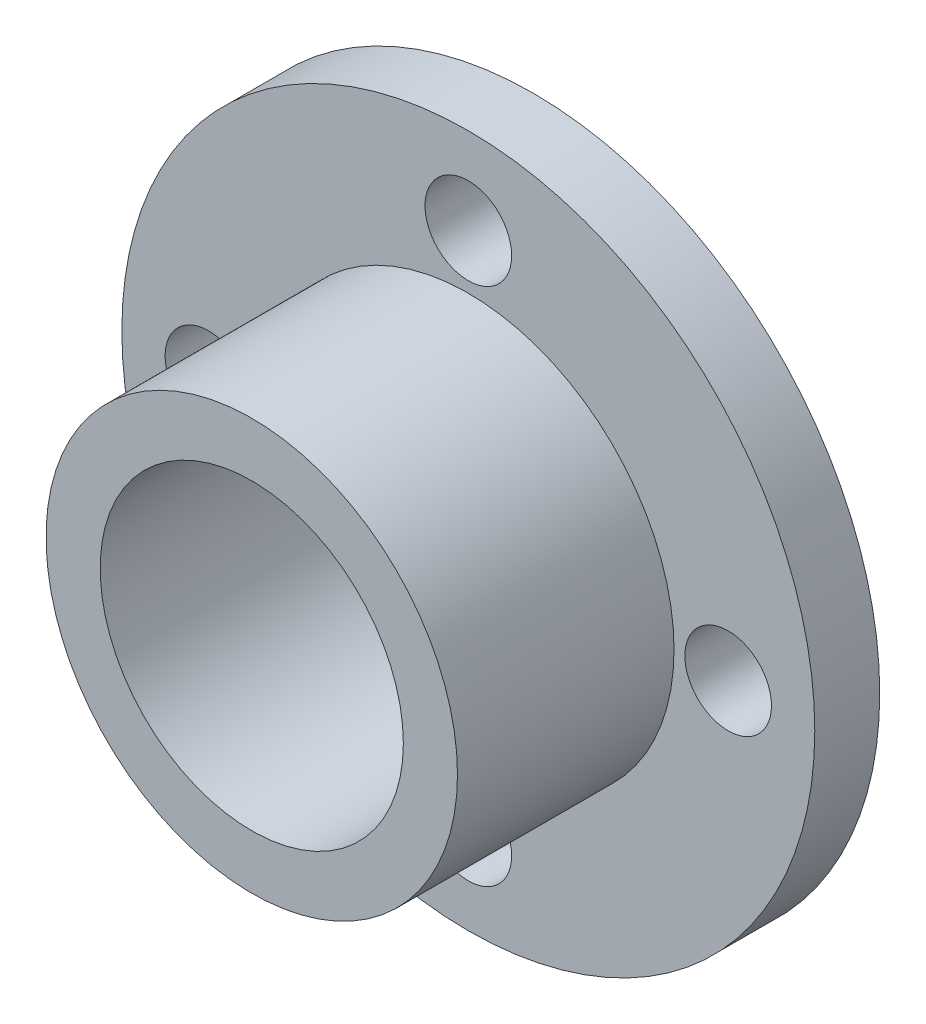
ISO-10303-21;
HEADER;
FILE_DESCRIPTION(('STEP AP214'),'2;1');
FILE_NAME('part.step','',(''),(''),'','','');
FILE_SCHEMA(('AUTOMOTIVE_DESIGN { 1 0 10303 214 1 1 1 1 }'));
ENDSEC;
DATA;
#1=APPLICATION_CONTEXT('core data for automotive mechanical design processes');
#2=APPLICATION_PROTOCOL_DEFINITION('international standard','automotive_design',2000,#1);
#3=PRODUCT_CONTEXT('',#1,'mechanical');
#4=PRODUCT('Part','Part','',(#3));
#5=PRODUCT_RELATED_PRODUCT_CATEGORY('part','',(#4));
#6=PRODUCT_DEFINITION_FORMATION('','',#4);
#7=PRODUCT_DEFINITION_CONTEXT('part definition',#1,'design');
#8=PRODUCT_DEFINITION('design','',#6,#7);
#9=PRODUCT_DEFINITION_SHAPE('','',#8);
#10=(LENGTH_UNIT() NAMED_UNIT(*) SI_UNIT(.MILLI.,.METRE.));
#11=(NAMED_UNIT(*) PLANE_ANGLE_UNIT() SI_UNIT($,.RADIAN.));
#12=(NAMED_UNIT(*) SI_UNIT($,.STERADIAN.) SOLID_ANGLE_UNIT());
#13=UNCERTAINTY_MEASURE_WITH_UNIT(LENGTH_MEASURE(1.E-05),#10,'distance_accuracy_value','');
#14=(GEOMETRIC_REPRESENTATION_CONTEXT(3) GLOBAL_UNCERTAINTY_ASSIGNED_CONTEXT((#13)) GLOBAL_UNIT_ASSIGNED_CONTEXT((#10,
#11,#12)) REPRESENTATION_CONTEXT('',''));
#15=CARTESIAN_POINT('',(0.,0.,0.));
#16=DIRECTION('',(0.,0.,1.));
#17=DIRECTION('',(1.,0.,0.));
#18=AXIS2_PLACEMENT_3D('',#15,#16,#17);
#19=CARTESIAN_POINT('',(0.,0.,3.));
#20=DIRECTION('',(0.,0.,1.));
#21=DIRECTION('',(1.,0.,0.));
#22=AXIS2_PLACEMENT_3D('',#19,#20,#21);
#23=PLANE('',#22);
#24=CARTESIAN_POINT('',(0.,-12.,3.));
#25=DIRECTION('',(0.,0.,1.));
#26=DIRECTION('',(1.,0.,0.));
#27=AXIS2_PLACEMENT_3D('',#24,#25,#26);
#28=CIRCLE('',#27,2.);
#29=CARTESIAN_POINT('',(2.,-12.,3.));
#30=VERTEX_POINT('',#29);
#31=EDGE_CURVE('E62',#30,#30,#28,.T.);
#32=ORIENTED_EDGE('',*,*,#31,.F.);
#33=EDGE_LOOP('',(#32));
#34=FACE_BOUND('',#33,.T.);
#35=CARTESIAN_POINT('',(-12.,0.,3.));
#36=DIRECTION('',(0.,0.,1.));
#37=DIRECTION('',(1.,0.,0.));
#38=AXIS2_PLACEMENT_3D('',#35,#36,#37);
#39=CIRCLE('',#38,2.);
#40=CARTESIAN_POINT('',(-10.,0.,3.));
#41=VERTEX_POINT('',#40);
#42=EDGE_CURVE('E122',#41,#41,#39,.T.);
#43=ORIENTED_EDGE('',*,*,#42,.F.);
#44=EDGE_LOOP('',(#43));
#45=FACE_BOUND('',#44,.T.);
#46=CARTESIAN_POINT('',(0.,12.,3.));
#47=DIRECTION('',(0.,0.,1.));
#48=DIRECTION('',(1.,0.,0.));
#49=AXIS2_PLACEMENT_3D('',#46,#47,#48);
#50=CIRCLE('',#49,2.);
#51=CARTESIAN_POINT('',(2.00000000000008,12.,3.));
#52=VERTEX_POINT('',#51);
#53=EDGE_CURVE('E126',#52,#52,#50,.T.);
#54=ORIENTED_EDGE('',*,*,#53,.F.);
#55=EDGE_LOOP('',(#54));
#56=FACE_BOUND('',#55,.T.);
#57=CARTESIAN_POINT('',(12.,-1.25693328198353E-13,3.));
#58=DIRECTION('',(0.,0.,1.));
#59=DIRECTION('',(1.,0.,0.));
#60=AXIS2_PLACEMENT_3D('',#57,#58,#59);
#61=CIRCLE('',#60,2.);
#62=CARTESIAN_POINT('',(14.,-1.25693328198353E-13,3.));
#63=VERTEX_POINT('',#62);
#64=EDGE_CURVE('E86',#63,#63,#61,.T.);
#65=ORIENTED_EDGE('',*,*,#64,.F.);
#66=EDGE_LOOP('',(#65));
#67=FACE_BOUND('',#66,.T.);
#68=CARTESIAN_POINT('',(0.,0.,3.));
#69=DIRECTION('',(0.,0.,1.));
#70=DIRECTION('',(1.,0.,0.));
#71=AXIS2_PLACEMENT_3D('',#68,#69,#70);
#72=CIRCLE('',#71,16.);
#73=CARTESIAN_POINT('',(16.,0.,3.));
#74=VERTEX_POINT('',#73);
#75=EDGE_CURVE('E10',#74,#74,#72,.T.);
#76=ORIENTED_EDGE('',*,*,#75,.T.);
#77=EDGE_LOOP('',(#76));
#78=FACE_BOUND('',#77,.T.);
#79=CARTESIAN_POINT('',(0.,0.,3.));
#80=DIRECTION('',(0.,0.,1.));
#81=DIRECTION('',(1.,0.,0.));
#82=AXIS2_PLACEMENT_3D('',#79,#80,#81);
#83=CIRCLE('',#82,9.5);
#84=CARTESIAN_POINT('',(9.5,0.,3.));
#85=VERTEX_POINT('',#84);
#86=EDGE_CURVE('E77',#85,#85,#83,.T.);
#87=ORIENTED_EDGE('',*,*,#86,.F.);
#88=EDGE_LOOP('',(#87));
#89=FACE_BOUND('',#88,.T.);
#90=ADVANCED_FACE('F37',(#34,#45,#56,#67,#78,#89),#23,.T.);
#91=CARTESIAN_POINT('',(0.,0.,0.));
#92=DIRECTION('',(0.,0.,1.));
#93=DIRECTION('',(1.,0.,0.));
#94=AXIS2_PLACEMENT_3D('',#91,#92,#93);
#95=PLANE('',#94);
#96=CARTESIAN_POINT('',(0.,-12.,0.));
#97=DIRECTION('',(0.,0.,1.));
#98=DIRECTION('',(1.,0.,0.));
#99=AXIS2_PLACEMENT_3D('',#96,#97,#98);
#100=CIRCLE('',#99,2.);
#101=CARTESIAN_POINT('',(2.,-12.,0.));
#102=VERTEX_POINT('',#101);
#103=EDGE_CURVE('E41',#102,#102,#100,.T.);
#104=ORIENTED_EDGE('',*,*,#103,.T.);
#105=EDGE_LOOP('',(#104));
#106=FACE_BOUND('',#105,.T.);
#107=CARTESIAN_POINT('',(-12.,0.,0.));
#108=DIRECTION('',(0.,0.,1.));
#109=DIRECTION('',(1.,0.,0.));
#110=AXIS2_PLACEMENT_3D('',#107,#108,#109);
#111=CIRCLE('',#110,2.);
#112=CARTESIAN_POINT('',(-10.,0.,0.));
#113=VERTEX_POINT('',#112);
#114=EDGE_CURVE('E65',#113,#113,#111,.T.);
#115=ORIENTED_EDGE('',*,*,#114,.T.);
#116=EDGE_LOOP('',(#115));
#117=FACE_BOUND('',#116,.T.);
#118=CARTESIAN_POINT('',(0.,12.,0.));
#119=DIRECTION('',(0.,0.,1.));
#120=DIRECTION('',(1.,0.,0.));
#121=AXIS2_PLACEMENT_3D('',#118,#119,#120);
#122=CIRCLE('',#121,2.);
#123=CARTESIAN_POINT('',(2.00000000000008,12.,0.));
#124=VERTEX_POINT('',#123);
#125=EDGE_CURVE('E61',#124,#124,#122,.T.);
#126=ORIENTED_EDGE('',*,*,#125,.T.);
#127=EDGE_LOOP('',(#126));
#128=FACE_BOUND('',#127,.T.);
#129=CARTESIAN_POINT('',(12.,-1.25693328198353E-13,0.));
#130=DIRECTION('',(0.,0.,1.));
#131=DIRECTION('',(1.,0.,0.));
#132=AXIS2_PLACEMENT_3D('',#129,#130,#131);
#133=CIRCLE('',#132,2.);
#134=CARTESIAN_POINT('',(14.,-1.25693328198353E-13,0.));
#135=VERTEX_POINT('',#134);
#136=EDGE_CURVE('E57',#135,#135,#133,.T.);
#137=ORIENTED_EDGE('',*,*,#136,.T.);
#138=EDGE_LOOP('',(#137));
#139=FACE_BOUND('',#138,.T.);
#140=CARTESIAN_POINT('',(0.,0.,0.));
#141=DIRECTION('',(0.,0.,1.));
#142=DIRECTION('',(1.,0.,0.));
#143=AXIS2_PLACEMENT_3D('',#140,#141,#142);
#144=CIRCLE('',#143,16.);
#145=CARTESIAN_POINT('',(16.,0.,0.));
#146=VERTEX_POINT('',#145);
#147=EDGE_CURVE('E46',#146,#146,#144,.T.);
#148=ORIENTED_EDGE('',*,*,#147,.F.);
#149=EDGE_LOOP('',(#148));
#150=FACE_BOUND('',#149,.T.);
#151=CARTESIAN_POINT('',(0.,0.,0.));
#152=DIRECTION('',(0.,0.,1.));
#153=DIRECTION('',(1.,0.,0.));
#154=AXIS2_PLACEMENT_3D('',#151,#152,#153);
#155=CIRCLE('',#154,7.);
#156=CARTESIAN_POINT('',(7.,0.,0.));
#157=VERTEX_POINT('',#156);
#158=EDGE_CURVE('E52',#157,#157,#155,.T.);
#159=ORIENTED_EDGE('',*,*,#158,.T.);
#160=EDGE_LOOP('',(#159));
#161=FACE_BOUND('',#160,.T.);
#162=ADVANCED_FACE('F96',(#106,#117,#128,#139,#150,#161),#95,.F.);
#163=CARTESIAN_POINT('',(0.,0.,3.));
#164=DIRECTION('',(0.,0.,-1.));
#165=DIRECTION('',(-1.,0.,0.));
#166=AXIS2_PLACEMENT_3D('',#163,#164,#165);
#167=CYLINDRICAL_SURFACE('',#166,16.);
#168=ORIENTED_EDGE('',*,*,#75,.F.);
#169=EDGE_LOOP('',(#168));
#170=FACE_BOUND('',#169,.T.);
#171=ORIENTED_EDGE('',*,*,#147,.T.);
#172=EDGE_LOOP('',(#171));
#173=FACE_BOUND('',#172,.T.);
#174=ADVANCED_FACE('F39',(#170,#173),#167,.T.);
#175=CARTESIAN_POINT('',(0.,0.,3.));
#176=DIRECTION('',(0.,0.,-1.));
#177=DIRECTION('',(-1.,0.,0.));
#178=AXIS2_PLACEMENT_3D('',#175,#176,#177);
#179=CYLINDRICAL_SURFACE('',#178,7.);
#180=ORIENTED_EDGE('',*,*,#158,.F.);
#181=EDGE_LOOP('',(#180));
#182=FACE_BOUND('',#181,.T.);
#183=CARTESIAN_POINT('',(0.,0.,13.));
#184=DIRECTION('',(0.,0.,1.));
#185=DIRECTION('',(1.,0.,0.));
#186=AXIS2_PLACEMENT_3D('',#183,#184,#185);
#187=CIRCLE('',#186,7.);
#188=CARTESIAN_POINT('',(7.,0.,13.));
#189=VERTEX_POINT('',#188);
#190=EDGE_CURVE('E72',#189,#189,#187,.T.);
#191=ORIENTED_EDGE('',*,*,#190,.T.);
#192=EDGE_LOOP('',(#191));
#193=FACE_BOUND('',#192,.T.);
#194=ADVANCED_FACE('F98',(#182,#193),#179,.F.);
#195=CARTESIAN_POINT('',(0.,0.,13.));
#196=DIRECTION('',(0.,0.,1.));
#197=DIRECTION('',(1.,0.,0.));
#198=AXIS2_PLACEMENT_3D('',#195,#196,#197);
#199=PLANE('',#198);
#200=CARTESIAN_POINT('',(0.,0.,13.));
#201=DIRECTION('',(0.,0.,1.));
#202=DIRECTION('',(1.,0.,0.));
#203=AXIS2_PLACEMENT_3D('',#200,#201,#202);
#204=CIRCLE('',#203,9.5);
#205=CARTESIAN_POINT('',(9.5,0.,13.));
#206=VERTEX_POINT('',#205);
#207=EDGE_CURVE('E83',#206,#206,#204,.T.);
#208=ORIENTED_EDGE('',*,*,#207,.T.);
#209=EDGE_LOOP('',(#208));
#210=FACE_BOUND('',#209,.T.);
#211=ORIENTED_EDGE('',*,*,#190,.F.);
#212=EDGE_LOOP('',(#211));
#213=FACE_BOUND('',#212,.T.);
#214=ADVANCED_FACE('F100',(#210,#213),#199,.T.);
#215=CARTESIAN_POINT('',(0.,0.,13.));
#216=DIRECTION('',(0.,0.,-1.));
#217=DIRECTION('',(-1.,0.,0.));
#218=AXIS2_PLACEMENT_3D('',#215,#216,#217);
#219=CYLINDRICAL_SURFACE('',#218,9.5);
#220=ORIENTED_EDGE('',*,*,#207,.F.);
#221=EDGE_LOOP('',(#220));
#222=FACE_BOUND('',#221,.T.);
#223=ORIENTED_EDGE('',*,*,#86,.T.);
#224=EDGE_LOOP('',(#223));
#225=FACE_BOUND('',#224,.T.);
#226=ADVANCED_FACE('F106',(#222,#225),#219,.T.);
#227=CARTESIAN_POINT('',(12.,-1.25693328198353E-13,-7.));
#228=DIRECTION('',(0.,0.,1.));
#229=DIRECTION('',(1.,0.,0.));
#230=AXIS2_PLACEMENT_3D('',#227,#228,#229);
#231=CYLINDRICAL_SURFACE('',#230,2.);
#232=ORIENTED_EDGE('',*,*,#64,.T.);
#233=EDGE_LOOP('',(#232));
#234=FACE_BOUND('',#233,.T.);
#235=ORIENTED_EDGE('',*,*,#136,.F.);
#236=EDGE_LOOP('',(#235));
#237=FACE_BOUND('',#236,.T.);
#238=ADVANCED_FACE('F133',(#234,#237),#231,.F.);
#239=CARTESIAN_POINT('',(0.,12.,-7.));
#240=DIRECTION('',(0.,0.,1.));
#241=DIRECTION('',(1.,0.,0.));
#242=AXIS2_PLACEMENT_3D('',#239,#240,#241);
#243=CYLINDRICAL_SURFACE('',#242,2.);
#244=ORIENTED_EDGE('',*,*,#53,.T.);
#245=EDGE_LOOP('',(#244));
#246=FACE_BOUND('',#245,.T.);
#247=ORIENTED_EDGE('',*,*,#125,.F.);
#248=EDGE_LOOP('',(#247));
#249=FACE_BOUND('',#248,.T.);
#250=ADVANCED_FACE('F138',(#246,#249),#243,.F.);
#251=CARTESIAN_POINT('',(-12.,0.,-7.));
#252=DIRECTION('',(0.,0.,1.));
#253=DIRECTION('',(1.,0.,0.));
#254=AXIS2_PLACEMENT_3D('',#251,#252,#253);
#255=CYLINDRICAL_SURFACE('',#254,2.);
#256=ORIENTED_EDGE('',*,*,#42,.T.);
#257=EDGE_LOOP('',(#256));
#258=FACE_BOUND('',#257,.T.);
#259=ORIENTED_EDGE('',*,*,#114,.F.);
#260=EDGE_LOOP('',(#259));
#261=FACE_BOUND('',#260,.T.);
#262=ADVANCED_FACE('F144',(#258,#261),#255,.F.);
#263=CARTESIAN_POINT('',(0.,-12.,-7.));
#264=DIRECTION('',(0.,0.,1.));
#265=DIRECTION('',(1.,0.,0.));
#266=AXIS2_PLACEMENT_3D('',#263,#264,#265);
#267=CYLINDRICAL_SURFACE('',#266,2.);
#268=ORIENTED_EDGE('',*,*,#31,.T.);
#269=EDGE_LOOP('',(#268));
#270=FACE_BOUND('',#269,.T.);
#271=ORIENTED_EDGE('',*,*,#103,.F.);
#272=EDGE_LOOP('',(#271));
#273=FACE_BOUND('',#272,.T.);
#274=ADVANCED_FACE('F148',(#270,#273),#267,.F.);
#275=CLOSED_SHELL('',(#90,#162,#174,#194,#214,#226,#238,#250,#262,#274));
#276=MANIFOLD_SOLID_BREP('B2',#275);
#277=ADVANCED_BREP_SHAPE_REPRESENTATION('',(#18,#276),#14);
#278=SHAPE_DEFINITION_REPRESENTATION(#9,#277);
ENDSEC;
END-ISO-10303-21;
